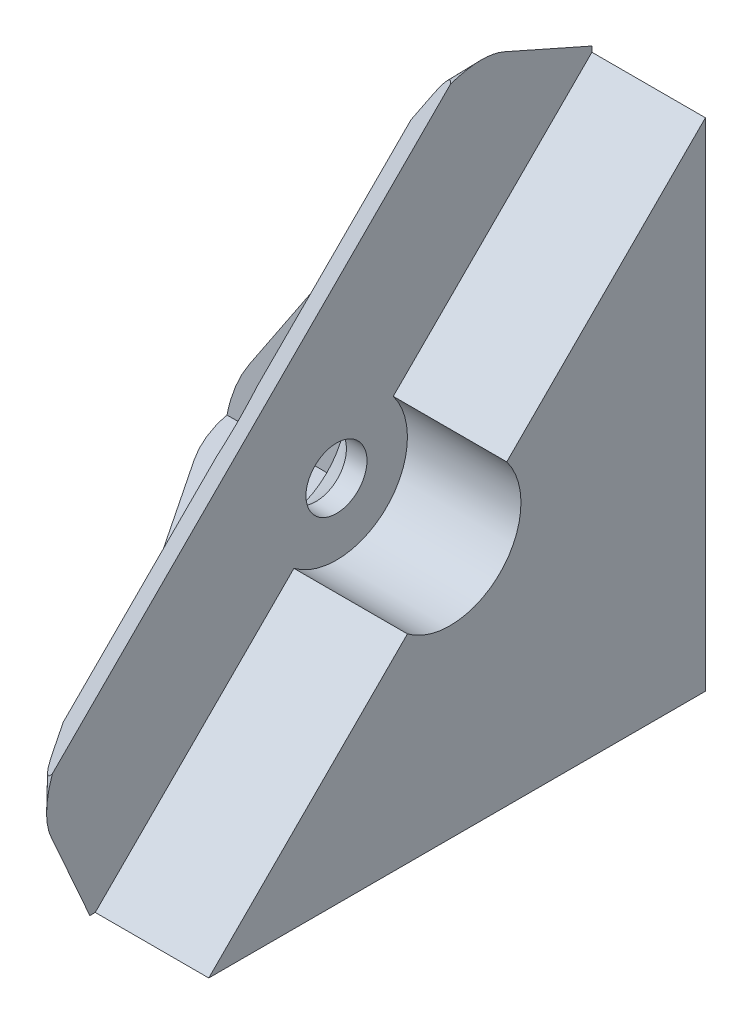
ISO-10303-21;
HEADER;
FILE_DESCRIPTION(('STEP AP214'),'2;1');
FILE_NAME('part.step','',(''),(''),'','','');
FILE_SCHEMA(('AUTOMOTIVE_DESIGN { 1 0 10303 214 1 1 1 1 }'));
ENDSEC;
DATA;
#1=APPLICATION_CONTEXT('core data for automotive mechanical design processes');
#2=APPLICATION_PROTOCOL_DEFINITION('international standard','automotive_design',2000,#1);
#3=PRODUCT_CONTEXT('',#1,'mechanical');
#4=PRODUCT('Part','Part','',(#3));
#5=PRODUCT_RELATED_PRODUCT_CATEGORY('part','',(#4));
#6=PRODUCT_DEFINITION_FORMATION('','',#4);
#7=PRODUCT_DEFINITION_CONTEXT('part definition',#1,'design');
#8=PRODUCT_DEFINITION('design','',#6,#7);
#9=PRODUCT_DEFINITION_SHAPE('','',#8);
#10=(LENGTH_UNIT() NAMED_UNIT(*) SI_UNIT(.MILLI.,.METRE.));
#11=(NAMED_UNIT(*) PLANE_ANGLE_UNIT() SI_UNIT($,.RADIAN.));
#12=(NAMED_UNIT(*) SI_UNIT($,.STERADIAN.) SOLID_ANGLE_UNIT());
#13=UNCERTAINTY_MEASURE_WITH_UNIT(LENGTH_MEASURE(1.E-05),#10,'distance_accuracy_value','');
#14=(GEOMETRIC_REPRESENTATION_CONTEXT(3) GLOBAL_UNCERTAINTY_ASSIGNED_CONTEXT((#13)) GLOBAL_UNIT_ASSIGNED_CONTEXT((#10,
#11,#12)) REPRESENTATION_CONTEXT('',''));
#15=CARTESIAN_POINT('',(0.,0.,0.));
#16=DIRECTION('',(0.,0.,1.));
#17=DIRECTION('',(1.,0.,0.));
#18=AXIS2_PLACEMENT_3D('',#15,#16,#17);
#19=CARTESIAN_POINT('',(-12.,0.,0.));
#20=DIRECTION('',(1.,0.,0.));
#21=DIRECTION('',(0.,0.,-1.));
#22=AXIS2_PLACEMENT_3D('',#19,#20,#21);
#23=PLANE('',#22);
#24=CARTESIAN_POINT('',(-12.,18.,18.));
#25=DIRECTION('',(-1.,0.,0.));
#26=DIRECTION('',(0.,0.,1.));
#27=AXIS2_PLACEMENT_3D('',#24,#25,#26);
#28=CIRCLE('',#27,4.7);
#29=CARTESIAN_POINT('',(-12.,22.4300349646075,19.5699650353925));
#30=VERTEX_POINT('',#29);
#31=CARTESIAN_POINT('',(-12.,19.5699650353925,22.4300349646075));
#32=VERTEX_POINT('',#31);
#33=EDGE_CURVE('E57',#30,#32,#28,.T.);
#34=ORIENTED_EDGE('',*,*,#33,.F.);
#35=DIRECTION('',(0.,-0.707106781186547,0.707106781186547));
#36=VECTOR('',#35,1.);
#37=CARTESIAN_POINT('',(-12.,21.,21.));
#38=LINE('',#37,#36);
#39=CARTESIAN_POINT('',(-12.,33.2552536780479,8.74474632195211));
#40=VERTEX_POINT('',#39);
#41=EDGE_CURVE('E419',#40,#30,#38,.T.);
#42=ORIENTED_EDGE('',*,*,#41,.F.);
#43=DIRECTION('',(0.,-0.405101821340606,-0.914271575816794));
#44=VECTOR('',#43,1.);
#45=CARTESIAN_POINT('',(-12.,30.385931706832,2.26899286454268));
#46=LINE('',#45,#44);
#47=CARTESIAN_POINT('',(-12.,31.5960053807068,5.));
#48=VERTEX_POINT('',#47);
#49=EDGE_CURVE('E557',#40,#48,#46,.T.);
#50=ORIENTED_EDGE('',*,*,#49,.T.);
#51=DIRECTION('',(0.,1.,0.));
#52=VECTOR('',#51,1.);
#53=CARTESIAN_POINT('',(-12.,0.,5.));
#54=LINE('',#53,#52);
#55=CARTESIAN_POINT('',(-12.,22.5,5.));
#56=VERTEX_POINT('',#55);
#57=EDGE_CURVE('E415',#56,#48,#54,.T.);
#58=ORIENTED_EDGE('',*,*,#57,.F.);
#59=DIRECTION('',(0.,0.707106781186548,-0.707106781186548));
#60=VECTOR('',#59,1.);
#61=CARTESIAN_POINT('',(-12.,22.5,5.));
#62=LINE('',#61,#60);
#63=CARTESIAN_POINT('',(-12.,5.,22.5));
#64=VERTEX_POINT('',#63);
#65=EDGE_CURVE('E401',#64,#56,#62,.T.);
#66=ORIENTED_EDGE('',*,*,#65,.F.);
#67=DIRECTION('',(0.,0.,-1.));
#68=VECTOR('',#67,1.);
#69=CARTESIAN_POINT('',(-12.,5.,0.));
#70=LINE('',#69,#68);
#71=CARTESIAN_POINT('',(-12.,5.,31.5960053807068));
#72=VERTEX_POINT('',#71);
#73=EDGE_CURVE('E412',#72,#64,#70,.T.);
#74=ORIENTED_EDGE('',*,*,#73,.F.);
#75=DIRECTION('',(0.,-0.914271575816795,-0.405101821340604));
#76=VECTOR('',#75,1.);
#77=CARTESIAN_POINT('',(-12.,-5.4822376893973,26.9514624549287));
#78=LINE('',#77,#76);
#79=CARTESIAN_POINT('',(-12.,8.74474632195212,33.2552536780479));
#80=VERTEX_POINT('',#79);
#81=EDGE_CURVE('E558',#72,#80,#78,.F.);
#82=ORIENTED_EDGE('',*,*,#81,.T.);
#83=EDGE_CURVE('E422',#32,#80,#38,.T.);
#84=ORIENTED_EDGE('',*,*,#83,.F.);
#85=EDGE_LOOP('',(#34,#42,#50,#58,#66,#74,#82,#84));
#86=FACE_BOUND('',#85,.T.);
#87=ADVANCED_FACE('F47',(#86),#23,.F.);
#88=CARTESIAN_POINT('',(0.,0.,60.));
#89=DIRECTION('',(-0.727606875108999,0.485071250072666,0.485071250072666));
#90=DIRECTION('',(0.,0.707106781186547,-0.707106781186547));
#91=AXIS2_PLACEMENT_3D('',#88,#89,#90);
#92=PLANE('',#91);
#93=CARTESIAN_POINT('',(-85.5999999999997,-34.1999999999998,-34.1999999999998));
#94=DIRECTION('',(-0.727606875108999,0.485071250072666,0.485071250072666));
#95=DIRECTION('',(-0.685994340570035,-0.514495755427526,-0.514495755427526));
#96=AXIS2_PLACEMENT_3D('',#93,#94,#95);
#97=ELLIPSE('',#96,107.613056828621,26.1);
#98=EDGE_CURVE('E12',#32,#30,#97,.T.);
#99=ORIENTED_EDGE('',*,*,#98,.F.);
#100=ORIENTED_EDGE('',*,*,#83,.T.);
#101=DIRECTION('',(0.554700196225229,0.,0.832050294337844));
#102=VECTOR('',#101,1.);
#103=CARTESIAN_POINT('',(4.0360367639779,8.74474632195211,57.3093088240147));
#104=LINE('',#103,#102);
#105=CARTESIAN_POINT('',(-10.5651279585277,8.74474632195211,35.4075617402563));
#106=VERTEX_POINT('',#105);
#107=EDGE_CURVE('E565',#80,#106,#104,.T.);
#108=ORIENTED_EDGE('',*,*,#107,.T.);
#109=CARTESIAN_POINT('',(-11.7638692322829,15.1768891786915,27.1773069728842));
#110=DIRECTION('',(-0.727606875108999,0.485071250072666,0.485071250072666));
#111=DIRECTION('',(-0.302732240434554,0.407478411677827,-0.861576772329658));
#112=AXIS2_PLACEMENT_3D('',#109,#110,#111);
#113=ELLIPSE('',#112,12.610865810412,5.);
#114=CARTESIAN_POINT('',(-8.,9.97204175585046,38.0279582441495));
#115=VERTEX_POINT('',#114);
#116=EDGE_CURVE('E541',#106,#115,#113,.T.);
#117=ORIENTED_EDGE('',*,*,#116,.T.);
#118=DIRECTION('',(0.,0.707106781186547,-0.707106781186547));
#119=VECTOR('',#118,1.);
#120=CARTESIAN_POINT('',(-8.,-5.99999999999999,54.));
#121=LINE('',#120,#119);
#122=CARTESIAN_POINT('',(-8.,38.0279582441496,9.97204175585044));
#123=VERTEX_POINT('',#122);
#124=EDGE_CURVE('E284',#115,#123,#121,.T.);
#125=ORIENTED_EDGE('',*,*,#124,.T.);
#126=CARTESIAN_POINT('',(-11.7638692322829,27.1773069728842,15.1768891786915));
#127=DIRECTION('',(-0.727606875108999,0.485071250072666,0.485071250072666));
#128=DIRECTION('',(-0.302732240434555,-0.861576772329658,0.407478411677826));
#129=AXIS2_PLACEMENT_3D('',#126,#127,#128);
#130=ELLIPSE('',#129,12.610865810412,5.);
#131=CARTESIAN_POINT('',(-10.5651279585277,35.4075617402563,8.74474632195211));
#132=VERTEX_POINT('',#131);
#133=EDGE_CURVE('E539',#123,#132,#130,.T.);
#134=ORIENTED_EDGE('',*,*,#133,.T.);
#135=DIRECTION('',(-0.554700196225229,-0.832050294337844,0.));
#136=VECTOR('',#135,1.);
#137=CARTESIAN_POINT('',(-35.9639632360221,-2.69069117598525,8.74474632195211));
#138=LINE('',#137,#136);
#139=EDGE_CURVE('E561',#132,#40,#138,.T.);
#140=ORIENTED_EDGE('',*,*,#139,.T.);
#141=ORIENTED_EDGE('',*,*,#41,.T.);
#142=EDGE_LOOP('',(#99,#100,#108,#117,#125,#134,#140,#141));
#143=FACE_BOUND('',#142,.T.);
#144=ADVANCED_FACE('F445',(#143),#92,.T.);
#145=CARTESIAN_POINT('',(-21.8679556319427,0.,14.5786370879618));
#146=DIRECTION('',(0.808003192842465,0.23867712375438,-0.53866879522831));
#147=DIRECTION('',(-0.554700196225229,0.,-0.832050294337844));
#148=AXIS2_PLACEMENT_3D('',#145,#146,#147);
#149=PLANE('',#148);
#150=DIRECTION('',(-0.554700196225229,0.,-0.832050294337844));
#151=VECTOR('',#150,1.);
#152=CARTESIAN_POINT('',(-21.8679556319427,0.,14.5786370879618));
#153=LINE('',#152,#151);
#154=CARTESIAN_POINT('',(-8.,0.,35.3805705358759));
#155=VERTEX_POINT('',#154);
#156=CARTESIAN_POINT('',(-28.9958939606416,0.,3.88672959491346));
#157=VERTEX_POINT('',#156);
#158=EDGE_CURVE('E527',#155,#157,#153,.T.);
#159=ORIENTED_EDGE('',*,*,#158,.F.);
#160=DIRECTION('',(0.,-0.914271575816795,-0.405101821340604));
#161=VECTOR('',#160,1.);
#162=CARTESIAN_POINT('',(-8.,-7.70447617277726,31.9668175410078));
#163=LINE('',#162,#161);
#164=CARTESIAN_POINT('',(-8.,6.17961836342445,38.1186789058934));
#165=VERTEX_POINT('',#164);
#166=EDGE_CURVE('E291',#155,#165,#163,.F.);
#167=ORIENTED_EDGE('',*,*,#166,.T.);
#168=DIRECTION('',(0.566404975696415,-0.56640497569641,0.598640799655932));
#169=VECTOR('',#168,1.);
#170=CARTESIAN_POINT('',(-18.4483264210769,16.6279447845013,27.0757065589623));
#171=LINE('',#170,#169);
#172=EDGE_CURVE('E537',#165,#106,#171,.F.);
#173=ORIENTED_EDGE('',*,*,#172,.T.);
#174=ORIENTED_EDGE('',*,*,#107,.F.);
#175=ORIENTED_EDGE('',*,*,#81,.F.);
#176=DIRECTION('',(-0.554700196225229,0.,-0.832050294337844));
#177=VECTOR('',#176,1.);
#178=CARTESIAN_POINT('',(-22.8904640218647,5.,15.2603093479098));
#179=LINE('',#178,#177);
#180=CARTESIAN_POINT('',(-27.1395171905289,5.,8.88672959491345));
#181=VERTEX_POINT('',#180);
#182=EDGE_CURVE('E529',#181,#72,#179,.F.);
#183=ORIENTED_EDGE('',*,*,#182,.F.);
#184=DIRECTION('',(0.253926469367306,0.683930313758155,0.683930313758154));
#185=VECTOR('',#184,1.);
#186=CARTESIAN_POINT('',(-26.6794518107825,6.23914872011261,10.1258783150261));
#187=LINE('',#186,#185);
#188=EDGE_CURVE('E519',#181,#157,#187,.F.);
#189=ORIENTED_EDGE('',*,*,#188,.T.);
#190=EDGE_LOOP('',(#159,#167,#173,#174,#175,#183,#189));
#191=FACE_BOUND('',#190,.T.);
#192=ADVANCED_FACE('F448',(#191),#149,.F.);
#193=CARTESIAN_POINT('',(-23.6562709283298,15.7708472855532,8.74474632195212));
#194=DIRECTION('',(-0.808003192842464,0.53866879522831,-0.238677123754382));
#195=DIRECTION('',(0.554700196225229,0.832050294337844,0.));
#196=AXIS2_PLACEMENT_3D('',#193,#194,#195);
#197=PLANE('',#196);
#198=DIRECTION('',(-0.566404975696415,-0.598640799655932,0.566404975696409));
#199=VECTOR('',#198,1.);
#200=CARTESIAN_POINT('',(-21.4232398935771,23.9314817436788,19.6028582570014));
#201=LINE('',#200,#199);
#202=CARTESIAN_POINT('',(-8.,38.1186789058934,6.17961836342444));
#203=VERTEX_POINT('',#202);
#204=EDGE_CURVE('E547',#132,#203,#201,.F.);
#205=ORIENTED_EDGE('',*,*,#204,.T.);
#206=DIRECTION('',(0.,-0.405101821340606,-0.914271575816794));
#207=VECTOR('',#206,1.);
#208=CARTESIAN_POINT('',(-8.,35.4012867929112,0.0467543811627086));
#209=LINE('',#208,#207);
#210=CARTESIAN_POINT('',(-8.,35.3805705358759,0.));
#211=VERTEX_POINT('',#210);
#212=EDGE_CURVE('E69',#203,#211,#209,.T.);
#213=ORIENTED_EDGE('',*,*,#212,.T.);
#214=DIRECTION('',(0.554700196225229,0.832050294337844,0.));
#215=VECTOR('',#214,1.);
#216=CARTESIAN_POINT('',(5.82435206036499,56.1170986264234,0.));
#217=LINE('',#216,#215);
#218=CARTESIAN_POINT('',(-28.9958939606416,3.88672959491342,0.));
#219=VERTEX_POINT('',#218);
#220=EDGE_CURVE('E249',#219,#211,#217,.T.);
#221=ORIENTED_EDGE('',*,*,#220,.F.);
#222=DIRECTION('',(-0.253926469367306,-0.683930313758155,-0.683930313758153));
#223=VECTOR('',#222,1.);
#224=CARTESIAN_POINT('',(-25.0690285072951,14.4634226363486,10.5766930414351));
#225=LINE('',#224,#223);
#226=CARTESIAN_POINT('',(-27.1395171905289,8.88672959491345,5.));
#227=VERTEX_POINT('',#226);
#228=EDGE_CURVE('E523',#219,#227,#225,.F.);
#229=ORIENTED_EDGE('',*,*,#228,.T.);
#230=DIRECTION('',(-0.554700196225229,-0.832050294337844,0.));
#231=VECTOR('',#230,1.);
#232=CARTESIAN_POINT('',(-22.8904640218647,15.2603093479098,5.));
#233=LINE('',#232,#231);
#234=EDGE_CURVE('E530',#48,#227,#233,.T.);
#235=ORIENTED_EDGE('',*,*,#234,.F.);
#236=ORIENTED_EDGE('',*,*,#49,.F.);
#237=ORIENTED_EDGE('',*,*,#139,.F.);
#238=EDGE_LOOP('',(#205,#213,#221,#229,#235,#236,#237));
#239=FACE_BOUND('',#238,.T.);
#240=ADVANCED_FACE('F451',(#239),#197,.T.);
#241=CARTESIAN_POINT('',(-14.4083104568646,17.8213304032732,24.3823625828208));
#242=DIRECTION('',(-0.566404975696414,0.56640497569641,-0.598640799655932));
#243=DIRECTION('',(-0.726393819624252,0.,0.687278705338445));
#244=AXIS2_PLACEMENT_3D('',#241,#242,#243);
#245=CYLINDRICAL_SURFACE('',#244,5.);
#246=ORIENTED_EDGE('',*,*,#172,.F.);
#247=CARTESIAN_POINT('',(-8.,11.4130199464086,31.1553894115912));
#248=DIRECTION('',(1.,0.,0.));
#249=DIRECTION('',(0.,0.687278705338442,-0.726393819624255));
#250=AXIS2_PLACEMENT_3D('',#247,#248,#249);
#251=ELLIPSE('',#250,8.82760606728839,5.);
#252=EDGE_CURVE('E288',#165,#115,#251,.F.);
#253=ORIENTED_EDGE('',*,*,#252,.T.);
#254=ORIENTED_EDGE('',*,*,#116,.F.);
#255=EDGE_LOOP('',(#246,#253,#254));
#256=FACE_BOUND('',#255,.T.);
#257=ADVANCED_FACE('F457',(#256),#245,.T.);
#258=CARTESIAN_POINT('',(-17.3832239293648,21.2381377675373,20.7962438757733));
#259=DIRECTION('',(-0.566404975696415,-0.598640799655932,0.566404975696409));
#260=DIRECTION('',(0.726393819624252,-0.687278705338446,0.));
#261=AXIS2_PLACEMENT_3D('',#258,#259,#260);
#262=CYLINDRICAL_SURFACE('',#261,5.);
#263=ORIENTED_EDGE('',*,*,#133,.F.);
#264=CARTESIAN_POINT('',(-8.,31.1553894115912,11.4130199464086));
#265=DIRECTION('',(1.,0.,0.));
#266=DIRECTION('',(0.,-0.726393819624255,0.687278705338442));
#267=AXIS2_PLACEMENT_3D('',#264,#265,#266);
#268=ELLIPSE('',#267,8.82760606728838,5.);
#269=EDGE_CURVE('E520',#123,#203,#268,.F.);
#270=ORIENTED_EDGE('',*,*,#269,.T.);
#271=ORIENTED_EDGE('',*,*,#204,.F.);
#272=EDGE_LOOP('',(#263,#270,#271));
#273=FACE_BOUND('',#272,.T.);
#274=ADVANCED_FACE('F49',(#273),#262,.T.);
#275=CARTESIAN_POINT('',(-12.,-0.00500999999999974,12.));
#276=DIRECTION('',(0.,1.,0.));
#277=DIRECTION('',(0.,0.,1.));
#278=AXIS2_PLACEMENT_3D('',#275,#276,#277);
#279=CYLINDRICAL_SURFACE('',#278,2.1);
#280=CARTESIAN_POINT('',(-12.,0.,12.));
#281=DIRECTION('',(0.,-1.,0.));
#282=DIRECTION('',(0.,0.,-1.));
#283=AXIS2_PLACEMENT_3D('',#280,#281,#282);
#284=CIRCLE('',#283,2.1);
#285=CARTESIAN_POINT('',(-12.,0.,9.9));
#286=VERTEX_POINT('',#285);
#287=EDGE_CURVE('E345',#286,#286,#284,.T.);
#288=ORIENTED_EDGE('',*,*,#287,.T.);
#289=EDGE_LOOP('',(#288));
#290=FACE_BOUND('',#289,.T.);
#291=CARTESIAN_POINT('',(-12.,2.5,12.));
#292=DIRECTION('',(0.,1.,0.));
#293=DIRECTION('',(0.,0.,1.));
#294=AXIS2_PLACEMENT_3D('',#291,#292,#293);
#295=CIRCLE('',#294,2.1);
#296=CARTESIAN_POINT('',(-12.,2.5,14.1));
#297=VERTEX_POINT('',#296);
#298=EDGE_CURVE('E334',#297,#297,#295,.F.);
#299=ORIENTED_EDGE('',*,*,#298,.F.);
#300=EDGE_LOOP('',(#299));
#301=FACE_BOUND('',#300,.T.);
#302=ADVANCED_FACE('F584',(#290,#301),#279,.F.);
#303=CARTESIAN_POINT('',(-12.,12.,60.00601));
#304=DIRECTION('',(0.,0.,-1.));
#305=DIRECTION('',(-1.,0.,0.));
#306=AXIS2_PLACEMENT_3D('',#303,#304,#305);
#307=CYLINDRICAL_SURFACE('',#306,2.1);
#308=CARTESIAN_POINT('',(-12.,12.,0.));
#309=DIRECTION('',(0.,0.,1.));
#310=DIRECTION('',(1.,0.,0.));
#311=AXIS2_PLACEMENT_3D('',#308,#309,#310);
#312=CIRCLE('',#311,2.1);
#313=CARTESIAN_POINT('',(-9.9,12.,0.));
#314=VERTEX_POINT('',#313);
#315=EDGE_CURVE('E250',#314,#314,#312,.F.);
#316=ORIENTED_EDGE('',*,*,#315,.T.);
#317=EDGE_LOOP('',(#316));
#318=FACE_BOUND('',#317,.T.);
#319=CARTESIAN_POINT('',(-12.,12.,2.5));
#320=DIRECTION('',(0.,0.,1.));
#321=DIRECTION('',(1.,0.,0.));
#322=AXIS2_PLACEMENT_3D('',#319,#320,#321);
#323=CIRCLE('',#322,2.1);
#324=CARTESIAN_POINT('',(-9.9,12.,2.5));
#325=VERTEX_POINT('',#324);
#326=EDGE_CURVE('E386',#325,#325,#323,.F.);
#327=ORIENTED_EDGE('',*,*,#326,.F.);
#328=EDGE_LOOP('',(#327));
#329=FACE_BOUND('',#328,.T.);
#330=ADVANCED_FACE('F582',(#318,#329),#307,.F.);
#331=CARTESIAN_POINT('',(0.,0.,0.));
#332=DIRECTION('',(1.,0.,0.));
#333=DIRECTION('',(0.,0.,-1.));
#334=AXIS2_PLACEMENT_3D('',#331,#332,#333);
#335=PLANE('',#334);
#336=DIRECTION('',(0.,-1.,0.));
#337=VECTOR('',#336,1.);
#338=CARTESIAN_POINT('',(0.,0.,0.));
#339=LINE('',#338,#337);
#340=CARTESIAN_POINT('',(0.,35.,0.));
#341=VERTEX_POINT('',#340);
#342=CARTESIAN_POINT('',(0.,0.,0.));
#343=VERTEX_POINT('',#342);
#344=EDGE_CURVE('E242',#341,#343,#339,.T.);
#345=ORIENTED_EDGE('',*,*,#344,.F.);
#346=DIRECTION('',(0.,0.707106781186548,-0.707106781186548));
#347=VECTOR('',#346,1.);
#348=CARTESIAN_POINT('',(0.,17.5,17.5));
#349=LINE('',#348,#347);
#350=CARTESIAN_POINT('',(0.,21.,14.));
#351=VERTEX_POINT('',#350);
#352=EDGE_CURVE('E257',#351,#341,#349,.T.);
#353=ORIENTED_EDGE('',*,*,#352,.F.);
#354=CARTESIAN_POINT('',(0.,18.,18.));
#355=DIRECTION('',(1.,0.,0.));
#356=DIRECTION('',(0.,0.,-1.));
#357=AXIS2_PLACEMENT_3D('',#354,#355,#356);
#358=CIRCLE('',#357,5.);
#359=CARTESIAN_POINT('',(0.,14.,21.));
#360=VERTEX_POINT('',#359);
#361=EDGE_CURVE('E267',#360,#351,#358,.T.);
#362=ORIENTED_EDGE('',*,*,#361,.F.);
#363=CARTESIAN_POINT('',(0.,0.,35.));
#364=VERTEX_POINT('',#363);
#365=EDGE_CURVE('E272',#364,#360,#349,.T.);
#366=ORIENTED_EDGE('',*,*,#365,.F.);
#367=DIRECTION('',(0.,0.,-1.));
#368=VECTOR('',#367,1.);
#369=CARTESIAN_POINT('',(0.,0.,60.));
#370=LINE('',#369,#368);
#371=EDGE_CURVE('E51',#364,#343,#370,.T.);
#372=ORIENTED_EDGE('',*,*,#371,.T.);
#373=EDGE_LOOP('',(#345,#353,#362,#366,#372));
#374=FACE_BOUND('',#373,.T.);
#375=ADVANCED_FACE('F255',(#374),#335,.T.);
#376=CARTESIAN_POINT('',(0.,0.,0.));
#377=DIRECTION('',(0.,-1.,0.));
#378=DIRECTION('',(0.,0.,1.));
#379=AXIS2_PLACEMENT_3D('',#376,#377,#378);
#380=PLANE('',#379);
#381=DIRECTION('',(-1.,0.,0.));
#382=VECTOR('',#381,1.);
#383=CARTESIAN_POINT('',(0.,0.,0.));
#384=LINE('',#383,#382);
#385=CARTESIAN_POINT('',(-30.5683885482844,0.,0.));
#386=VERTEX_POINT('',#385);
#387=EDGE_CURVE('E261',#343,#386,#384,.T.);
#388=ORIENTED_EDGE('',*,*,#387,.F.);
#389=ORIENTED_EDGE('',*,*,#371,.F.);
#390=DIRECTION('',(1.,0.,0.));
#391=VECTOR('',#390,1.);
#392=CARTESIAN_POINT('',(-8.,0.,35.));
#393=LINE('',#392,#391);
#394=CARTESIAN_POINT('',(-8.,0.,35.));
#395=VERTEX_POINT('',#394);
#396=EDGE_CURVE('E285',#395,#364,#393,.T.);
#397=ORIENTED_EDGE('',*,*,#396,.F.);
#398=DIRECTION('',(0.,0.,1.));
#399=VECTOR('',#398,1.);
#400=CARTESIAN_POINT('',(-8.,0.,0.));
#401=LINE('',#400,#399);
#402=EDGE_CURVE('E625',#395,#155,#401,.T.);
#403=ORIENTED_EDGE('',*,*,#402,.T.);
#404=ORIENTED_EDGE('',*,*,#158,.T.);
#405=CARTESIAN_POINT('',(-25.3989526645243,0.,0.));
#406=DIRECTION('',(0.,-1.,0.));
#407=DIRECTION('',(-0.348060303070731,0.,-0.937472146480263));
#408=AXIS2_PLACEMENT_3D('',#405,#406,#407);
#409=ELLIPSE('',#408,7.31068633663173,5.);
#410=EDGE_CURVE('E544',#157,#386,#409,.T.);
#411=ORIENTED_EDGE('',*,*,#410,.T.);
#412=EDGE_LOOP('',(#388,#389,#397,#403,#404,#411));
#413=FACE_BOUND('',#412,.T.);
#414=ORIENTED_EDGE('',*,*,#287,.F.);
#415=EDGE_LOOP('',(#414));
#416=FACE_BOUND('',#415,.T.);
#417=ADVANCED_FACE('F431',(#413,#416),#380,.T.);
#418=CARTESIAN_POINT('',(0.,0.,5.));
#419=DIRECTION('',(0.,0.,1.));
#420=DIRECTION('',(1.,0.,0.));
#421=AXIS2_PLACEMENT_3D('',#418,#419,#420);
#422=PLANE('',#421);
#423=DIRECTION('',(-0.866025403784439,0.5,0.));
#424=VECTOR('',#423,1.);
#425=CARTESIAN_POINT('',(-8.5,14.0207259421637,5.));
#426=LINE('',#425,#424);
#427=CARTESIAN_POINT('',(-8.5,14.0207259421637,5.));
#428=VERTEX_POINT('',#427);
#429=CARTESIAN_POINT('',(-12.,16.0414518843274,5.));
#430=VERTEX_POINT('',#429);
#431=EDGE_CURVE('E348',#428,#430,#426,.T.);
#432=ORIENTED_EDGE('',*,*,#431,.F.);
#433=DIRECTION('',(0.,1.,0.));
#434=VECTOR('',#433,1.);
#435=CARTESIAN_POINT('',(-8.5,9.97927405783631,5.));
#436=LINE('',#435,#434);
#437=CARTESIAN_POINT('',(-8.5,9.97927405783631,5.));
#438=VERTEX_POINT('',#437);
#439=EDGE_CURVE('E353',#438,#428,#436,.T.);
#440=ORIENTED_EDGE('',*,*,#439,.F.);
#441=DIRECTION('',(0.866025403784439,0.5,0.));
#442=VECTOR('',#441,1.);
#443=CARTESIAN_POINT('',(-12.,7.95854811567262,5.));
#444=LINE('',#443,#442);
#445=CARTESIAN_POINT('',(-12.,7.95854811567262,5.));
#446=VERTEX_POINT('',#445);
#447=EDGE_CURVE('E379',#446,#438,#444,.T.);
#448=ORIENTED_EDGE('',*,*,#447,.F.);
#449=DIRECTION('',(0.866025403784438,-0.5,0.));
#450=VECTOR('',#449,1.);
#451=CARTESIAN_POINT('',(-15.5,9.97927405783631,5.));
#452=LINE('',#451,#450);
#453=CARTESIAN_POINT('',(-15.5,9.97927405783631,5.));
#454=VERTEX_POINT('',#453);
#455=EDGE_CURVE('E376',#454,#446,#452,.T.);
#456=ORIENTED_EDGE('',*,*,#455,.F.);
#457=DIRECTION('',(0.,-1.,0.));
#458=VECTOR('',#457,1.);
#459=CARTESIAN_POINT('',(-15.5,14.0207259421637,5.));
#460=LINE('',#459,#458);
#461=CARTESIAN_POINT('',(-15.5,14.0207259421637,5.));
#462=VERTEX_POINT('',#461);
#463=EDGE_CURVE('E373',#462,#454,#460,.T.);
#464=ORIENTED_EDGE('',*,*,#463,.F.);
#465=DIRECTION('',(-0.866025403784438,-0.5,0.));
#466=VECTOR('',#465,1.);
#467=CARTESIAN_POINT('',(-12.,16.0414518843274,5.));
#468=LINE('',#467,#466);
#469=EDGE_CURVE('E370',#430,#462,#468,.T.);
#470=ORIENTED_EDGE('',*,*,#469,.F.);
#471=EDGE_LOOP('',(#432,#440,#448,#456,#464,#470));
#472=FACE_BOUND('',#471,.T.);
#473=ORIENTED_EDGE('',*,*,#234,.T.);
#474=CARTESIAN_POINT('',(-23.5425758944116,4.99999999999999,5.));
#475=DIRECTION('',(0.,0.,1.));
#476=DIRECTION('',(-0.34806030307073,-0.937472146480263,0.));
#477=AXIS2_PLACEMENT_3D('',#474,#475,#476);
#478=ELLIPSE('',#477,7.31068633663175,5.);
#479=CARTESIAN_POINT('',(-28.7120117781717,5.,5.));
#480=VERTEX_POINT('',#479);
#481=EDGE_CURVE('E516',#227,#480,#478,.T.);
#482=ORIENTED_EDGE('',*,*,#481,.T.);
#483=DIRECTION('',(1.,0.,0.));
#484=VECTOR('',#483,1.);
#485=CARTESIAN_POINT('',(0.,5.,5.));
#486=LINE('',#485,#484);
#487=CARTESIAN_POINT('',(-7.,5.,5.));
#488=VERTEX_POINT('',#487);
#489=EDGE_CURVE('E418',#480,#488,#486,.T.);
#490=ORIENTED_EDGE('',*,*,#489,.T.);
#491=DIRECTION('',(0.,-1.,0.));
#492=VECTOR('',#491,1.);
#493=CARTESIAN_POINT('',(-7.,22.5,5.));
#494=LINE('',#493,#492);
#495=CARTESIAN_POINT('',(-7.,22.5,5.));
#496=VERTEX_POINT('',#495);
#497=EDGE_CURVE('E397',#496,#488,#494,.T.);
#498=ORIENTED_EDGE('',*,*,#497,.F.);
#499=DIRECTION('',(-1.,0.,0.));
#500=VECTOR('',#499,1.);
#501=CARTESIAN_POINT('',(-7.,22.5,5.));
#502=LINE('',#501,#500);
#503=EDGE_CURVE('E410',#496,#56,#502,.T.);
#504=ORIENTED_EDGE('',*,*,#503,.T.);
#505=ORIENTED_EDGE('',*,*,#57,.T.);
#506=EDGE_LOOP('',(#473,#482,#490,#498,#504,#505));
#507=FACE_BOUND('',#506,.T.);
#508=ADVANCED_FACE('F441',(#472,#507),#422,.T.);
#509=CARTESIAN_POINT('',(0.,5.,0.));
#510=DIRECTION('',(0.,-1.,0.));
#511=DIRECTION('',(0.,0.,1.));
#512=AXIS2_PLACEMENT_3D('',#509,#510,#511);
#513=PLANE('',#512);
#514=DIRECTION('',(-0.866025403784439,0.,0.5));
#515=VECTOR('',#514,1.);
#516=CARTESIAN_POINT('',(-12.,5.,7.95854811567262));
#517=LINE('',#516,#515);
#518=CARTESIAN_POINT('',(-12.,5.,7.95854811567262));
#519=VERTEX_POINT('',#518);
#520=CARTESIAN_POINT('',(-15.5,5.,9.97927405783631));
#521=VERTEX_POINT('',#520);
#522=EDGE_CURVE('E318',#519,#521,#517,.T.);
#523=ORIENTED_EDGE('',*,*,#522,.F.);
#524=DIRECTION('',(-0.866025403784439,0.,-0.5));
#525=VECTOR('',#524,1.);
#526=CARTESIAN_POINT('',(-8.5,5.,9.97927405783631));
#527=LINE('',#526,#525);
#528=CARTESIAN_POINT('',(-8.5,5.,9.97927405783631));
#529=VERTEX_POINT('',#528);
#530=EDGE_CURVE('E294',#529,#519,#527,.T.);
#531=ORIENTED_EDGE('',*,*,#530,.F.);
#532=DIRECTION('',(0.,0.,-1.));
#533=VECTOR('',#532,1.);
#534=CARTESIAN_POINT('',(-8.5,5.,14.0207259421637));
#535=LINE('',#534,#533);
#536=CARTESIAN_POINT('',(-8.5,5.,14.0207259421637));
#537=VERTEX_POINT('',#536);
#538=EDGE_CURVE('E301',#537,#529,#535,.T.);
#539=ORIENTED_EDGE('',*,*,#538,.F.);
#540=DIRECTION('',(0.866025403784439,0.,-0.5));
#541=VECTOR('',#540,1.);
#542=CARTESIAN_POINT('',(-12.,5.,16.0414518843274));
#543=LINE('',#542,#541);
#544=CARTESIAN_POINT('',(-12.,5.,16.0414518843274));
#545=VERTEX_POINT('',#544);
#546=EDGE_CURVE('E327',#545,#537,#543,.T.);
#547=ORIENTED_EDGE('',*,*,#546,.F.);
#548=DIRECTION('',(0.866025403784439,0.,0.5));
#549=VECTOR('',#548,1.);
#550=CARTESIAN_POINT('',(-15.5,5.,14.0207259421637));
#551=LINE('',#550,#549);
#552=CARTESIAN_POINT('',(-15.5,5.,14.0207259421637));
#553=VERTEX_POINT('',#552);
#554=EDGE_CURVE('E324',#553,#545,#551,.T.);
#555=ORIENTED_EDGE('',*,*,#554,.F.);
#556=DIRECTION('',(0.,0.,1.));
#557=VECTOR('',#556,1.);
#558=CARTESIAN_POINT('',(-15.5,5.,9.97927405783631));
#559=LINE('',#558,#557);
#560=EDGE_CURVE('E321',#521,#553,#559,.T.);
#561=ORIENTED_EDGE('',*,*,#560,.F.);
#562=EDGE_LOOP('',(#523,#531,#539,#547,#555,#561));
#563=FACE_BOUND('',#562,.T.);
#564=ORIENTED_EDGE('',*,*,#489,.F.);
#565=CARTESIAN_POINT('',(-23.5425758944116,5.,5.00000000000001));
#566=DIRECTION('',(0.,-1.,0.));
#567=DIRECTION('',(-0.348060303070731,0.,-0.937472146480263));
#568=AXIS2_PLACEMENT_3D('',#565,#566,#567);
#569=ELLIPSE('',#568,7.31068633663173,5.);
#570=EDGE_CURVE('E510',#480,#181,#569,.F.);
#571=ORIENTED_EDGE('',*,*,#570,.T.);
#572=ORIENTED_EDGE('',*,*,#182,.T.);
#573=ORIENTED_EDGE('',*,*,#73,.T.);
#574=DIRECTION('',(-1.,0.,0.));
#575=VECTOR('',#574,1.);
#576=CARTESIAN_POINT('',(-7.,5.,22.5));
#577=LINE('',#576,#575);
#578=CARTESIAN_POINT('',(-7.,5.,22.5));
#579=VERTEX_POINT('',#578);
#580=EDGE_CURVE('E407',#579,#64,#577,.T.);
#581=ORIENTED_EDGE('',*,*,#580,.F.);
#582=DIRECTION('',(0.,0.,1.));
#583=VECTOR('',#582,1.);
#584=CARTESIAN_POINT('',(-7.,5.,5.));
#585=LINE('',#584,#583);
#586=EDGE_CURVE('E400',#488,#579,#585,.T.);
#587=ORIENTED_EDGE('',*,*,#586,.F.);
#588=EDGE_LOOP('',(#564,#571,#572,#573,#581,#587));
#589=FACE_BOUND('',#588,.T.);
#590=ADVANCED_FACE('F492',(#563,#589),#513,.F.);
#591=CARTESIAN_POINT('',(-7.,22.5,5.));
#592=DIRECTION('',(0.,0.707106781186548,0.707106781186548));
#593=DIRECTION('',(0.,-0.707106781186548,0.707106781186548));
#594=AXIS2_PLACEMENT_3D('',#591,#592,#593);
#595=PLANE('',#594);
#596=ORIENTED_EDGE('',*,*,#65,.T.);
#597=ORIENTED_EDGE('',*,*,#503,.F.);
#598=DIRECTION('',(0.,0.707106781186548,-0.707106781186548));
#599=VECTOR('',#598,1.);
#600=CARTESIAN_POINT('',(-7.,22.5,5.));
#601=LINE('',#600,#599);
#602=EDGE_CURVE('E404',#579,#496,#601,.T.);
#603=ORIENTED_EDGE('',*,*,#602,.F.);
#604=ORIENTED_EDGE('',*,*,#580,.T.);
#605=EDGE_LOOP('',(#596,#597,#603,#604));
#606=FACE_BOUND('',#605,.T.);
#607=ADVANCED_FACE('F494',(#606),#595,.F.);
#608=CARTESIAN_POINT('',(-7.,0.,0.));
#609=DIRECTION('',(-1.,0.,0.));
#610=DIRECTION('',(0.,0.,1.));
#611=AXIS2_PLACEMENT_3D('',#608,#609,#610);
#612=PLANE('',#611);
#613=ORIENTED_EDGE('',*,*,#497,.T.);
#614=ORIENTED_EDGE('',*,*,#586,.T.);
#615=ORIENTED_EDGE('',*,*,#602,.T.);
#616=EDGE_LOOP('',(#613,#614,#615));
#617=FACE_BOUND('',#616,.T.);
#618=ADVANCED_FACE('F499',(#617),#612,.T.);
#619=CARTESIAN_POINT('',(0.,0.,2.5));
#620=DIRECTION('',(0.,0.,1.));
#621=DIRECTION('',(1.,0.,0.));
#622=AXIS2_PLACEMENT_3D('',#619,#620,#621);
#623=PLANE('',#622);
#624=DIRECTION('',(-0.866025403784439,0.5,0.));
#625=VECTOR('',#624,1.);
#626=CARTESIAN_POINT('',(-8.5,14.0207259421637,2.5));
#627=LINE('',#626,#625);
#628=CARTESIAN_POINT('',(-8.5,14.0207259421637,2.5));
#629=VERTEX_POINT('',#628);
#630=CARTESIAN_POINT('',(-12.,16.0414518843274,2.5));
#631=VERTEX_POINT('',#630);
#632=EDGE_CURVE('E349',#629,#631,#627,.T.);
#633=ORIENTED_EDGE('',*,*,#632,.T.);
#634=DIRECTION('',(-0.866025403784438,-0.5,0.));
#635=VECTOR('',#634,1.);
#636=CARTESIAN_POINT('',(-12.,16.0414518843274,2.5));
#637=LINE('',#636,#635);
#638=CARTESIAN_POINT('',(-15.5,14.0207259421637,2.5));
#639=VERTEX_POINT('',#638);
#640=EDGE_CURVE('E352',#631,#639,#637,.T.);
#641=ORIENTED_EDGE('',*,*,#640,.T.);
#642=DIRECTION('',(0.,-1.,0.));
#643=VECTOR('',#642,1.);
#644=CARTESIAN_POINT('',(-15.5,14.0207259421637,2.5));
#645=LINE('',#644,#643);
#646=CARTESIAN_POINT('',(-15.5,9.97927405783631,2.5));
#647=VERTEX_POINT('',#646);
#648=EDGE_CURVE('E356',#639,#647,#645,.T.);
#649=ORIENTED_EDGE('',*,*,#648,.T.);
#650=DIRECTION('',(0.866025403784438,-0.5,0.));
#651=VECTOR('',#650,1.);
#652=CARTESIAN_POINT('',(-15.5,9.97927405783631,2.5));
#653=LINE('',#652,#651);
#654=CARTESIAN_POINT('',(-12.,7.95854811567262,2.5));
#655=VERTEX_POINT('',#654);
#656=EDGE_CURVE('E359',#647,#655,#653,.T.);
#657=ORIENTED_EDGE('',*,*,#656,.T.);
#658=DIRECTION('',(0.866025403784439,0.5,0.));
#659=VECTOR('',#658,1.);
#660=CARTESIAN_POINT('',(-12.,7.95854811567262,2.5));
#661=LINE('',#660,#659);
#662=CARTESIAN_POINT('',(-8.5,9.97927405783631,2.5));
#663=VERTEX_POINT('',#662);
#664=EDGE_CURVE('E362',#655,#663,#661,.T.);
#665=ORIENTED_EDGE('',*,*,#664,.T.);
#666=DIRECTION('',(0.,1.,0.));
#667=VECTOR('',#666,1.);
#668=CARTESIAN_POINT('',(-8.5,9.97927405783631,2.5));
#669=LINE('',#668,#667);
#670=EDGE_CURVE('E365',#663,#629,#669,.T.);
#671=ORIENTED_EDGE('',*,*,#670,.T.);
#672=EDGE_LOOP('',(#633,#641,#649,#657,#665,#671));
#673=FACE_BOUND('',#672,.T.);
#674=ORIENTED_EDGE('',*,*,#326,.T.);
#675=EDGE_LOOP('',(#674));
#676=FACE_BOUND('',#675,.T.);
#677=ADVANCED_FACE('F580',(#673,#676),#623,.T.);
#678=CARTESIAN_POINT('',(-8.5,14.0207259421637,2.5));
#679=DIRECTION('',(0.5,0.866025403784439,0.));
#680=DIRECTION('',(-0.866025403784439,0.5,0.));
#681=AXIS2_PLACEMENT_3D('',#678,#679,#680);
#682=PLANE('',#681);
#683=ORIENTED_EDGE('',*,*,#431,.T.);
#684=DIRECTION('',(0.,0.,1.));
#685=VECTOR('',#684,1.);
#686=CARTESIAN_POINT('',(-12.,16.0414518843274,2.5));
#687=LINE('',#686,#685);
#688=EDGE_CURVE('E368',#631,#430,#687,.T.);
#689=ORIENTED_EDGE('',*,*,#688,.F.);
#690=ORIENTED_EDGE('',*,*,#632,.F.);
#691=DIRECTION('',(0.,0.,1.));
#692=VECTOR('',#691,1.);
#693=CARTESIAN_POINT('',(-8.5,14.0207259421637,2.5));
#694=LINE('',#693,#692);
#695=EDGE_CURVE('E384',#629,#428,#694,.T.);
#696=ORIENTED_EDGE('',*,*,#695,.T.);
#697=EDGE_LOOP('',(#683,#689,#690,#696));
#698=FACE_BOUND('',#697,.T.);
#699=ADVANCED_FACE('F596',(#698),#682,.F.);
#700=CARTESIAN_POINT('',(-8.5,9.97927405783631,2.5));
#701=DIRECTION('',(1.,0.,0.));
#702=DIRECTION('',(0.,0.,-1.));
#703=AXIS2_PLACEMENT_3D('',#700,#701,#702);
#704=PLANE('',#703);
#705=ORIENTED_EDGE('',*,*,#439,.T.);
#706=ORIENTED_EDGE('',*,*,#695,.F.);
#707=ORIENTED_EDGE('',*,*,#670,.F.);
#708=DIRECTION('',(0.,0.,1.));
#709=VECTOR('',#708,1.);
#710=CARTESIAN_POINT('',(-8.5,9.97927405783631,2.5));
#711=LINE('',#710,#709);
#712=EDGE_CURVE('E387',#663,#438,#711,.T.);
#713=ORIENTED_EDGE('',*,*,#712,.T.);
#714=EDGE_LOOP('',(#705,#706,#707,#713));
#715=FACE_BOUND('',#714,.T.);
#716=ADVANCED_FACE('F695',(#715),#704,.F.);
#717=CARTESIAN_POINT('',(-12.,7.95854811567262,2.5));
#718=DIRECTION('',(0.5,-0.866025403784438,0.));
#719=DIRECTION('',(0.866025403784439,0.5,0.));
#720=AXIS2_PLACEMENT_3D('',#717,#718,#719);
#721=PLANE('',#720);
#722=ORIENTED_EDGE('',*,*,#447,.T.);
#723=ORIENTED_EDGE('',*,*,#712,.F.);
#724=ORIENTED_EDGE('',*,*,#664,.F.);
#725=DIRECTION('',(0.,0.,1.));
#726=VECTOR('',#725,1.);
#727=CARTESIAN_POINT('',(-12.,7.95854811567262,2.5));
#728=LINE('',#727,#726);
#729=EDGE_CURVE('E389',#655,#446,#728,.T.);
#730=ORIENTED_EDGE('',*,*,#729,.T.);
#731=EDGE_LOOP('',(#722,#723,#724,#730));
#732=FACE_BOUND('',#731,.T.);
#733=ADVANCED_FACE('F698',(#732),#721,.F.);
#734=CARTESIAN_POINT('',(-15.5,9.97927405783631,2.5));
#735=DIRECTION('',(-0.5,-0.866025403784438,0.));
#736=DIRECTION('',(0.866025403784439,-0.5,0.));
#737=AXIS2_PLACEMENT_3D('',#734,#735,#736);
#738=PLANE('',#737);
#739=ORIENTED_EDGE('',*,*,#455,.T.);
#740=ORIENTED_EDGE('',*,*,#729,.F.);
#741=ORIENTED_EDGE('',*,*,#656,.F.);
#742=DIRECTION('',(0.,0.,1.));
#743=VECTOR('',#742,1.);
#744=CARTESIAN_POINT('',(-15.5,9.97927405783631,2.5));
#745=LINE('',#744,#743);
#746=EDGE_CURVE('E391',#647,#454,#745,.T.);
#747=ORIENTED_EDGE('',*,*,#746,.T.);
#748=EDGE_LOOP('',(#739,#740,#741,#747));
#749=FACE_BOUND('',#748,.T.);
#750=ADVANCED_FACE('F702',(#749),#738,.F.);
#751=CARTESIAN_POINT('',(-15.5,14.0207259421637,2.5));
#752=DIRECTION('',(-1.,0.,0.));
#753=DIRECTION('',(0.,0.,1.));
#754=AXIS2_PLACEMENT_3D('',#751,#752,#753);
#755=PLANE('',#754);
#756=ORIENTED_EDGE('',*,*,#463,.T.);
#757=ORIENTED_EDGE('',*,*,#746,.F.);
#758=ORIENTED_EDGE('',*,*,#648,.F.);
#759=DIRECTION('',(0.,0.,1.));
#760=VECTOR('',#759,1.);
#761=CARTESIAN_POINT('',(-15.5,14.0207259421637,2.5));
#762=LINE('',#761,#760);
#763=EDGE_CURVE('E393',#639,#462,#762,.T.);
#764=ORIENTED_EDGE('',*,*,#763,.T.);
#765=EDGE_LOOP('',(#756,#757,#758,#764));
#766=FACE_BOUND('',#765,.T.);
#767=ADVANCED_FACE('F706',(#766),#755,.F.);
#768=CARTESIAN_POINT('',(-12.,16.0414518843274,2.5));
#769=DIRECTION('',(-0.5,0.866025403784438,0.));
#770=DIRECTION('',(-0.866025403784438,-0.5,0.));
#771=AXIS2_PLACEMENT_3D('',#768,#769,#770);
#772=PLANE('',#771);
#773=ORIENTED_EDGE('',*,*,#469,.T.);
#774=ORIENTED_EDGE('',*,*,#763,.F.);
#775=ORIENTED_EDGE('',*,*,#640,.F.);
#776=ORIENTED_EDGE('',*,*,#688,.T.);
#777=EDGE_LOOP('',(#773,#774,#775,#776));
#778=FACE_BOUND('',#777,.T.);
#779=ADVANCED_FACE('F675',(#778),#772,.F.);
#780=CARTESIAN_POINT('',(0.,2.5,0.));
#781=DIRECTION('',(0.,1.,0.));
#782=DIRECTION('',(0.,0.,1.));
#783=AXIS2_PLACEMENT_3D('',#780,#781,#782);
#784=PLANE('',#783);
#785=DIRECTION('',(-0.866025403784439,0.,-0.5));
#786=VECTOR('',#785,1.);
#787=CARTESIAN_POINT('',(-8.5,2.5,9.97927405783631));
#788=LINE('',#787,#786);
#789=CARTESIAN_POINT('',(-8.5,2.5,9.97927405783631));
#790=VERTEX_POINT('',#789);
#791=CARTESIAN_POINT('',(-12.,2.5,7.95854811567262));
#792=VERTEX_POINT('',#791);
#793=EDGE_CURVE('E297',#790,#792,#788,.T.);
#794=ORIENTED_EDGE('',*,*,#793,.T.);
#795=DIRECTION('',(-0.866025403784439,0.,0.5));
#796=VECTOR('',#795,1.);
#797=CARTESIAN_POINT('',(-12.,2.5,7.95854811567262));
#798=LINE('',#797,#796);
#799=CARTESIAN_POINT('',(-15.5,2.5,9.97927405783631));
#800=VERTEX_POINT('',#799);
#801=EDGE_CURVE('E300',#792,#800,#798,.T.);
#802=ORIENTED_EDGE('',*,*,#801,.T.);
#803=DIRECTION('',(0.,0.,1.));
#804=VECTOR('',#803,1.);
#805=CARTESIAN_POINT('',(-15.5,2.5,9.97927405783631));
#806=LINE('',#805,#804);
#807=CARTESIAN_POINT('',(-15.5,2.5,14.0207259421637));
#808=VERTEX_POINT('',#807);
#809=EDGE_CURVE('E304',#800,#808,#806,.T.);
#810=ORIENTED_EDGE('',*,*,#809,.T.);
#811=DIRECTION('',(0.866025403784439,0.,0.5));
#812=VECTOR('',#811,1.);
#813=CARTESIAN_POINT('',(-15.5,2.5,14.0207259421637));
#814=LINE('',#813,#812);
#815=CARTESIAN_POINT('',(-12.,2.5,16.0414518843274));
#816=VERTEX_POINT('',#815);
#817=EDGE_CURVE('E307',#808,#816,#814,.T.);
#818=ORIENTED_EDGE('',*,*,#817,.T.);
#819=DIRECTION('',(0.866025403784439,0.,-0.5));
#820=VECTOR('',#819,1.);
#821=CARTESIAN_POINT('',(-12.,2.5,16.0414518843274));
#822=LINE('',#821,#820);
#823=CARTESIAN_POINT('',(-8.5,2.5,14.0207259421637));
#824=VERTEX_POINT('',#823);
#825=EDGE_CURVE('E310',#816,#824,#822,.T.);
#826=ORIENTED_EDGE('',*,*,#825,.T.);
#827=DIRECTION('',(0.,0.,-1.));
#828=VECTOR('',#827,1.);
#829=CARTESIAN_POINT('',(-8.5,2.5,14.0207259421637));
#830=LINE('',#829,#828);
#831=EDGE_CURVE('E313',#824,#790,#830,.T.);
#832=ORIENTED_EDGE('',*,*,#831,.T.);
#833=EDGE_LOOP('',(#794,#802,#810,#818,#826,#832));
#834=FACE_BOUND('',#833,.T.);
#835=ORIENTED_EDGE('',*,*,#298,.T.);
#836=EDGE_LOOP('',(#835));
#837=FACE_BOUND('',#836,.T.);
#838=ADVANCED_FACE('F671',(#834,#837),#784,.T.);
#839=CARTESIAN_POINT('',(-8.5,2.5,9.97927405783631));
#840=DIRECTION('',(0.5,0.,-0.866025403784439));
#841=DIRECTION('',(-0.866025403784439,0.,-0.5));
#842=AXIS2_PLACEMENT_3D('',#839,#840,#841);
#843=PLANE('',#842);
#844=ORIENTED_EDGE('',*,*,#530,.T.);
#845=DIRECTION('',(0.,1.,0.));
#846=VECTOR('',#845,1.);
#847=CARTESIAN_POINT('',(-12.,2.5,7.95854811567262));
#848=LINE('',#847,#846);
#849=EDGE_CURVE('E316',#792,#519,#848,.T.);
#850=ORIENTED_EDGE('',*,*,#849,.F.);
#851=ORIENTED_EDGE('',*,*,#793,.F.);
#852=DIRECTION('',(0.,1.,0.));
#853=VECTOR('',#852,1.);
#854=CARTESIAN_POINT('',(-8.5,2.5,9.97927405783631));
#855=LINE('',#854,#853);
#856=EDGE_CURVE('E332',#790,#529,#855,.T.);
#857=ORIENTED_EDGE('',*,*,#856,.T.);
#858=EDGE_LOOP('',(#844,#850,#851,#857));
#859=FACE_BOUND('',#858,.T.);
#860=ADVANCED_FACE('F674',(#859),#843,.F.);
#861=CARTESIAN_POINT('',(-8.5,2.5,14.0207259421637));
#862=DIRECTION('',(1.,0.,0.));
#863=DIRECTION('',(0.,0.,-1.));
#864=AXIS2_PLACEMENT_3D('',#861,#862,#863);
#865=PLANE('',#864);
#866=ORIENTED_EDGE('',*,*,#538,.T.);
#867=ORIENTED_EDGE('',*,*,#856,.F.);
#868=ORIENTED_EDGE('',*,*,#831,.F.);
#869=DIRECTION('',(0.,1.,0.));
#870=VECTOR('',#869,1.);
#871=CARTESIAN_POINT('',(-8.5,2.5,14.0207259421637));
#872=LINE('',#871,#870);
#873=EDGE_CURVE('E335',#824,#537,#872,.T.);
#874=ORIENTED_EDGE('',*,*,#873,.T.);
#875=EDGE_LOOP('',(#866,#867,#868,#874));
#876=FACE_BOUND('',#875,.T.);
#877=ADVANCED_FACE('F677',(#876),#865,.F.);
#878=CARTESIAN_POINT('',(-12.,2.5,16.0414518843274));
#879=DIRECTION('',(0.5,0.,0.866025403784439));
#880=DIRECTION('',(0.866025403784439,0.,-0.5));
#881=AXIS2_PLACEMENT_3D('',#878,#879,#880);
#882=PLANE('',#881);
#883=ORIENTED_EDGE('',*,*,#546,.T.);
#884=ORIENTED_EDGE('',*,*,#873,.F.);
#885=ORIENTED_EDGE('',*,*,#825,.F.);
#886=DIRECTION('',(0.,1.,0.));
#887=VECTOR('',#886,1.);
#888=CARTESIAN_POINT('',(-12.,2.5,16.0414518843274));
#889=LINE('',#888,#887);
#890=EDGE_CURVE('E337',#816,#545,#889,.T.);
#891=ORIENTED_EDGE('',*,*,#890,.T.);
#892=EDGE_LOOP('',(#883,#884,#885,#891));
#893=FACE_BOUND('',#892,.T.);
#894=ADVANCED_FACE('F680',(#893),#882,.F.);
#895=CARTESIAN_POINT('',(-15.5,2.5,14.0207259421637));
#896=DIRECTION('',(-0.5,0.,0.866025403784438));
#897=DIRECTION('',(0.866025403784439,0.,0.5));
#898=AXIS2_PLACEMENT_3D('',#895,#896,#897);
#899=PLANE('',#898);
#900=ORIENTED_EDGE('',*,*,#554,.T.);
#901=ORIENTED_EDGE('',*,*,#890,.F.);
#902=ORIENTED_EDGE('',*,*,#817,.F.);
#903=DIRECTION('',(0.,1.,0.));
#904=VECTOR('',#903,1.);
#905=CARTESIAN_POINT('',(-15.5,2.5,14.0207259421637));
#906=LINE('',#905,#904);
#907=EDGE_CURVE('E339',#808,#553,#906,.T.);
#908=ORIENTED_EDGE('',*,*,#907,.T.);
#909=EDGE_LOOP('',(#900,#901,#902,#908));
#910=FACE_BOUND('',#909,.T.);
#911=ADVANCED_FACE('F684',(#910),#899,.F.);
#912=CARTESIAN_POINT('',(-15.5,2.5,9.97927405783631));
#913=DIRECTION('',(-1.,0.,0.));
#914=DIRECTION('',(0.,0.,1.));
#915=AXIS2_PLACEMENT_3D('',#912,#913,#914);
#916=PLANE('',#915);
#917=ORIENTED_EDGE('',*,*,#560,.T.);
#918=ORIENTED_EDGE('',*,*,#907,.F.);
#919=ORIENTED_EDGE('',*,*,#809,.F.);
#920=DIRECTION('',(0.,1.,0.));
#921=VECTOR('',#920,1.);
#922=CARTESIAN_POINT('',(-15.5,2.5,9.97927405783631));
#923=LINE('',#922,#921);
#924=EDGE_CURVE('E341',#800,#521,#923,.T.);
#925=ORIENTED_EDGE('',*,*,#924,.T.);
#926=EDGE_LOOP('',(#917,#918,#919,#925));
#927=FACE_BOUND('',#926,.T.);
#928=ADVANCED_FACE('F478',(#927),#916,.F.);
#929=CARTESIAN_POINT('',(-12.,2.5,7.95854811567262));
#930=DIRECTION('',(-0.5,0.,-0.866025403784439));
#931=DIRECTION('',(-0.866025403784439,0.,0.5));
#932=AXIS2_PLACEMENT_3D('',#929,#930,#931);
#933=PLANE('',#932);
#934=ORIENTED_EDGE('',*,*,#522,.T.);
#935=ORIENTED_EDGE('',*,*,#924,.F.);
#936=ORIENTED_EDGE('',*,*,#801,.F.);
#937=ORIENTED_EDGE('',*,*,#849,.T.);
#938=EDGE_LOOP('',(#934,#935,#936,#937));
#939=FACE_BOUND('',#938,.T.);
#940=ADVANCED_FACE('F469',(#939),#933,.F.);
#941=CARTESIAN_POINT('',(-21.0290125430827,11.770078660207,11.770078660207));
#942=DIRECTION('',(-0.253926469367306,-0.683930313758155,-0.683930313758153));
#943=DIRECTION('',(0.,0.707106781186547,-0.707106781186548));
#944=AXIS2_PLACEMENT_3D('',#941,#942,#943);
#945=CYLINDRICAL_SURFACE('',#944,5.);
#946=ORIENTED_EDGE('',*,*,#410,.F.);
#947=ORIENTED_EDGE('',*,*,#188,.F.);
#948=ORIENTED_EDGE('',*,*,#570,.F.);
#949=ORIENTED_EDGE('',*,*,#481,.F.);
#950=ORIENTED_EDGE('',*,*,#228,.F.);
#951=CARTESIAN_POINT('',(-25.3989526645243,0.,0.));
#952=DIRECTION('',(0.,0.,1.));
#953=DIRECTION('',(-0.34806030307073,-0.937472146480263,0.));
#954=AXIS2_PLACEMENT_3D('',#951,#952,#953);
#955=ELLIPSE('',#954,7.31068633663175,5.);
#956=EDGE_CURVE('E644',#386,#219,#955,.F.);
#957=ORIENTED_EDGE('',*,*,#956,.F.);
#958=EDGE_LOOP('',(#946,#947,#948,#949,#950,#957));
#959=FACE_BOUND('',#958,.T.);
#960=ADVANCED_FACE('F466',(#959),#945,.T.);
#961=CARTESIAN_POINT('',(-8.,17.5,17.5));
#962=DIRECTION('',(0.,-0.707106781186547,-0.707106781186547));
#963=DIRECTION('',(0.,0.707106781186548,-0.707106781186548));
#964=AXIS2_PLACEMENT_3D('',#961,#962,#963);
#965=PLANE('',#964);
#966=ORIENTED_EDGE('',*,*,#365,.T.);
#967=DIRECTION('',(1.,0.,0.));
#968=VECTOR('',#967,1.);
#969=CARTESIAN_POINT('',(-8.,14.,21.));
#970=LINE('',#969,#968);
#971=CARTESIAN_POINT('',(-8.,14.,21.));
#972=VERTEX_POINT('',#971);
#973=EDGE_CURVE('E627',#972,#360,#970,.T.);
#974=ORIENTED_EDGE('',*,*,#973,.F.);
#975=DIRECTION('',(0.,0.707106781186548,-0.707106781186548));
#976=VECTOR('',#975,1.);
#977=CARTESIAN_POINT('',(-8.,17.5,17.5));
#978=LINE('',#977,#976);
#979=EDGE_CURVE('E266',#395,#972,#978,.T.);
#980=ORIENTED_EDGE('',*,*,#979,.F.);
#981=ORIENTED_EDGE('',*,*,#396,.T.);
#982=EDGE_LOOP('',(#966,#974,#980,#981));
#983=FACE_BOUND('',#982,.T.);
#984=ADVANCED_FACE('F468',(#983),#965,.F.);
#985=ORIENTED_EDGE('',*,*,#352,.T.);
#986=DIRECTION('',(1.,0.,0.));
#987=VECTOR('',#986,1.);
#988=CARTESIAN_POINT('',(-8.,35.,0.));
#989=LINE('',#988,#987);
#990=CARTESIAN_POINT('',(-8.,35.,0.));
#991=VERTEX_POINT('',#990);
#992=EDGE_CURVE('E238',#991,#341,#989,.T.);
#993=ORIENTED_EDGE('',*,*,#992,.F.);
#994=CARTESIAN_POINT('',(-8.,21.,14.));
#995=VERTEX_POINT('',#994);
#996=EDGE_CURVE('E628',#995,#991,#978,.T.);
#997=ORIENTED_EDGE('',*,*,#996,.F.);
#998=DIRECTION('',(1.,0.,0.));
#999=VECTOR('',#998,1.);
#1000=CARTESIAN_POINT('',(-8.,21.,14.));
#1001=LINE('',#1000,#999);
#1002=EDGE_CURVE('E264',#995,#351,#1001,.T.);
#1003=ORIENTED_EDGE('',*,*,#1002,.T.);
#1004=EDGE_LOOP('',(#985,#993,#997,#1003));
#1005=FACE_BOUND('',#1004,.T.);
#1006=ADVANCED_FACE('F263',(#1005),#965,.F.);
#1007=CARTESIAN_POINT('',(-8.,18.,18.));
#1008=DIRECTION('',(1.,0.,0.));
#1009=DIRECTION('',(0.,0.,-1.));
#1010=AXIS2_PLACEMENT_3D('',#1007,#1008,#1009);
#1011=CYLINDRICAL_SURFACE('',#1010,5.);
#1012=ORIENTED_EDGE('',*,*,#361,.T.);
#1013=ORIENTED_EDGE('',*,*,#1002,.F.);
#1014=CARTESIAN_POINT('',(-8.,18.,18.));
#1015=DIRECTION('',(1.,0.,0.));
#1016=DIRECTION('',(0.,0.,-1.));
#1017=AXIS2_PLACEMENT_3D('',#1014,#1015,#1016);
#1018=CIRCLE('',#1017,5.);
#1019=EDGE_CURVE('E270',#972,#995,#1018,.T.);
#1020=ORIENTED_EDGE('',*,*,#1019,.F.);
#1021=ORIENTED_EDGE('',*,*,#973,.T.);
#1022=EDGE_LOOP('',(#1012,#1013,#1020,#1021));
#1023=FACE_BOUND('',#1022,.T.);
#1024=ADVANCED_FACE('F657',(#1023),#1011,.F.);
#1025=CARTESIAN_POINT('',(-8.,0.,0.));
#1026=DIRECTION('',(1.,0.,0.));
#1027=DIRECTION('',(0.,0.,-1.));
#1028=AXIS2_PLACEMENT_3D('',#1025,#1026,#1027);
#1029=PLANE('',#1028);
#1030=DIRECTION('',(0.,-1.,0.));
#1031=VECTOR('',#1030,1.);
#1032=CARTESIAN_POINT('',(-8.,0.,0.));
#1033=LINE('',#1032,#1031);
#1034=EDGE_CURVE('E244',#211,#991,#1033,.T.);
#1035=ORIENTED_EDGE('',*,*,#1034,.F.);
#1036=ORIENTED_EDGE('',*,*,#212,.F.);
#1037=ORIENTED_EDGE('',*,*,#269,.F.);
#1038=ORIENTED_EDGE('',*,*,#124,.F.);
#1039=ORIENTED_EDGE('',*,*,#252,.F.);
#1040=ORIENTED_EDGE('',*,*,#166,.F.);
#1041=ORIENTED_EDGE('',*,*,#402,.F.);
#1042=ORIENTED_EDGE('',*,*,#979,.T.);
#1043=ORIENTED_EDGE('',*,*,#1019,.T.);
#1044=ORIENTED_EDGE('',*,*,#996,.T.);
#1045=EDGE_LOOP('',(#1035,#1036,#1037,#1038,#1039,#1040,#1041,#1042,#1043,#1044));
#1046=FACE_BOUND('',#1045,.T.);
#1047=CARTESIAN_POINT('',(-8.,18.,18.));
#1048=DIRECTION('',(1.,0.,0.));
#1049=DIRECTION('',(0.,0.,-1.));
#1050=AXIS2_PLACEMENT_3D('',#1047,#1048,#1049);
#1051=CIRCLE('',#1050,2.15);
#1052=CARTESIAN_POINT('',(-8.,18.,15.85));
#1053=VERTEX_POINT('',#1052);
#1054=EDGE_CURVE('E281',#1053,#1053,#1051,.T.);
#1055=ORIENTED_EDGE('',*,*,#1054,.F.);
#1056=EDGE_LOOP('',(#1055));
#1057=FACE_BOUND('',#1056,.T.);
#1058=ADVANCED_FACE('F620',(#1046,#1057),#1029,.T.);
#1059=CARTESIAN_POINT('',(-12.,18.,18.));
#1060=DIRECTION('',(-1.,0.,0.));
#1061=DIRECTION('',(0.,0.,1.));
#1062=AXIS2_PLACEMENT_3D('',#1059,#1060,#1061);
#1063=CYLINDRICAL_SURFACE('',#1062,2.15);
#1064=CARTESIAN_POINT('',(-9.45,18.,18.));
#1065=DIRECTION('',(-1.,0.,0.));
#1066=DIRECTION('',(0.,0.,1.));
#1067=AXIS2_PLACEMENT_3D('',#1064,#1065,#1066);
#1068=CIRCLE('',#1067,2.15);
#1069=CARTESIAN_POINT('',(-9.45,18.,20.15));
#1070=VERTEX_POINT('',#1069);
#1071=EDGE_CURVE('E646',#1070,#1070,#1068,.T.);
#1072=ORIENTED_EDGE('',*,*,#1071,.T.);
#1073=EDGE_LOOP('',(#1072));
#1074=FACE_BOUND('',#1073,.T.);
#1075=ORIENTED_EDGE('',*,*,#1054,.T.);
#1076=EDGE_LOOP('',(#1075));
#1077=FACE_BOUND('',#1076,.T.);
#1078=ADVANCED_FACE('F655',(#1074,#1077),#1063,.F.);
#1079=CARTESIAN_POINT('',(-12.,18.,18.));
#1080=DIRECTION('',(-1.,0.,0.));
#1081=DIRECTION('',(0.,0.,1.));
#1082=AXIS2_PLACEMENT_3D('',#1079,#1080,#1081);
#1083=CONICAL_SURFACE('',#1082,4.7,0.785398163397448);
#1084=ORIENTED_EDGE('',*,*,#98,.T.);
#1085=ORIENTED_EDGE('',*,*,#33,.T.);
#1086=EDGE_LOOP('',(#1084,#1085));
#1087=FACE_BOUND('',#1086,.T.);
#1088=ORIENTED_EDGE('',*,*,#1071,.F.);
#1089=EDGE_LOOP('',(#1088));
#1090=FACE_BOUND('',#1089,.T.);
#1091=ADVANCED_FACE('F663',(#1087,#1090),#1083,.F.);
#1092=CARTESIAN_POINT('',(0.,0.,0.));
#1093=DIRECTION('',(0.,0.,1.));
#1094=DIRECTION('',(1.,0.,0.));
#1095=AXIS2_PLACEMENT_3D('',#1092,#1093,#1094);
#1096=PLANE('',#1095);
#1097=ORIENTED_EDGE('',*,*,#344,.T.);
#1098=ORIENTED_EDGE('',*,*,#387,.T.);
#1099=ORIENTED_EDGE('',*,*,#956,.T.);
#1100=ORIENTED_EDGE('',*,*,#220,.T.);
#1101=ORIENTED_EDGE('',*,*,#1034,.T.);
#1102=ORIENTED_EDGE('',*,*,#992,.T.);
#1103=EDGE_LOOP('',(#1097,#1098,#1099,#1100,#1101,#1102));
#1104=FACE_BOUND('',#1103,.T.);
#1105=ORIENTED_EDGE('',*,*,#315,.F.);
#1106=EDGE_LOOP('',(#1105));
#1107=FACE_BOUND('',#1106,.T.);
#1108=ADVANCED_FACE('F240',(#1104,#1107),#1096,.F.);
#1109=CLOSED_SHELL('',(#87,#144,#192,#240,#257,#274,#302,#330,#375,#417,#508,#590,#607,#618,
#677,#699,#716,#733,#750,#767,#779,#838,#860,#877,#894,#911,#928,#940,#960,#984,#1006,#1024,
#1058,#1078,#1091,#1108));
#1110=MANIFOLD_SOLID_BREP('B2',#1109);
#1111=ADVANCED_BREP_SHAPE_REPRESENTATION('',(#18,#1110),#14);
#1112=SHAPE_DEFINITION_REPRESENTATION(#9,#1111);
ENDSEC;
END-ISO-10303-21;
